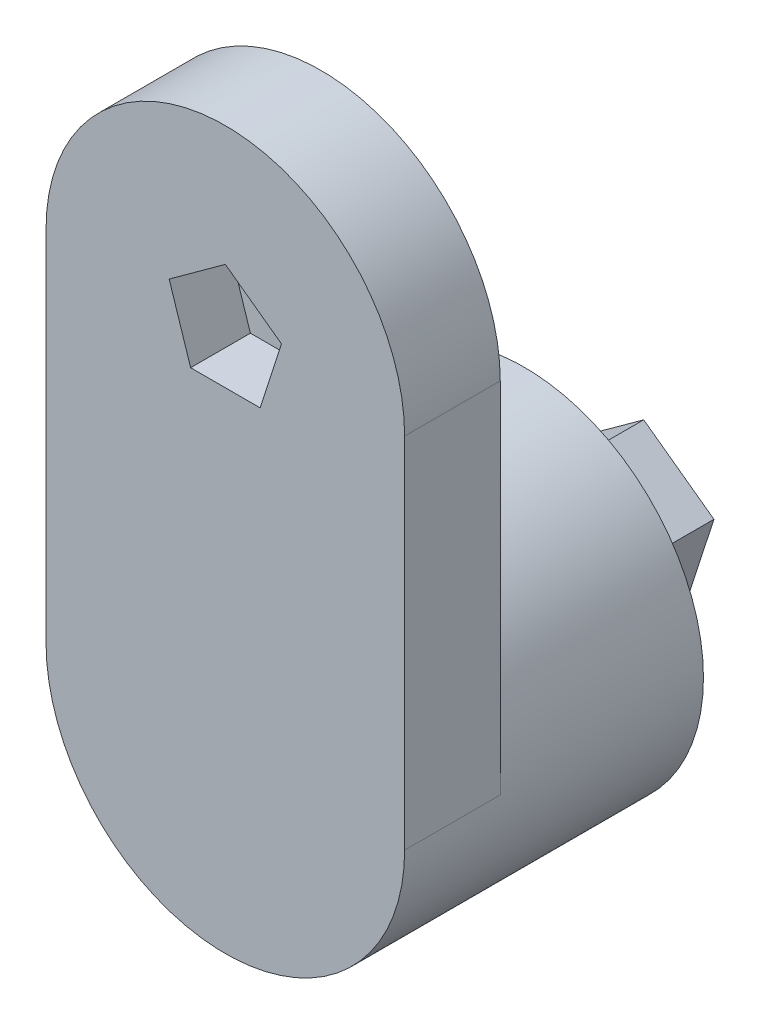
ISO-10303-21;
HEADER;
FILE_DESCRIPTION(('STEP AP214'),'2;1');
FILE_NAME('part.step','',(''),(''),'','','');
FILE_SCHEMA(('AUTOMOTIVE_DESIGN { 1 0 10303 214 1 1 1 1 }'));
ENDSEC;
DATA;
#1=APPLICATION_CONTEXT('core data for automotive mechanical design processes');
#2=APPLICATION_PROTOCOL_DEFINITION('international standard','automotive_design',2000,#1);
#3=PRODUCT_CONTEXT('',#1,'mechanical');
#4=PRODUCT('Part','Part','',(#3));
#5=PRODUCT_RELATED_PRODUCT_CATEGORY('part','',(#4));
#6=PRODUCT_DEFINITION_FORMATION('','',#4);
#7=PRODUCT_DEFINITION_CONTEXT('part definition',#1,'design');
#8=PRODUCT_DEFINITION('design','',#6,#7);
#9=PRODUCT_DEFINITION_SHAPE('','',#8);
#10=(LENGTH_UNIT() NAMED_UNIT(*) SI_UNIT(.MILLI.,.METRE.));
#11=(NAMED_UNIT(*) PLANE_ANGLE_UNIT() SI_UNIT($,.RADIAN.));
#12=(NAMED_UNIT(*) SI_UNIT($,.STERADIAN.) SOLID_ANGLE_UNIT());
#13=UNCERTAINTY_MEASURE_WITH_UNIT(LENGTH_MEASURE(1.E-05),#10,'distance_accuracy_value','');
#14=(GEOMETRIC_REPRESENTATION_CONTEXT(3) GLOBAL_UNCERTAINTY_ASSIGNED_CONTEXT((#13)) GLOBAL_UNIT_ASSIGNED_CONTEXT((#10,
#11,#12)) REPRESENTATION_CONTEXT('',''));
#15=CARTESIAN_POINT('',(0.,0.,0.));
#16=DIRECTION('',(0.,0.,1.));
#17=DIRECTION('',(1.,0.,0.));
#18=AXIS2_PLACEMENT_3D('',#15,#16,#17);
#19=CARTESIAN_POINT('',(0.,15.,0.));
#20=DIRECTION('',(0.,0.,1.));
#21=DIRECTION('',(1.,0.,0.));
#22=AXIS2_PLACEMENT_3D('',#19,#20,#21);
#23=PLANE('',#22);
#24=CARTESIAN_POINT('',(0.,-15.,0.));
#25=DIRECTION('',(0.,0.,-1.));
#26=DIRECTION('',(-1.,0.,0.));
#27=AXIS2_PLACEMENT_3D('',#24,#25,#26);
#28=CIRCLE('',#27,15.);
#29=CARTESIAN_POINT('',(-15.,-15.,0.));
#30=VERTEX_POINT('',#29);
#31=CARTESIAN_POINT('',(15.,-15.,0.));
#32=VERTEX_POINT('',#31);
#33=EDGE_CURVE('E164',#30,#32,#28,.T.);
#34=ORIENTED_EDGE('',*,*,#33,.F.);
#35=DIRECTION('',(0.,-1.,0.));
#36=VECTOR('',#35,1.);
#37=CARTESIAN_POINT('',(-15.,15.,0.));
#38=LINE('',#37,#36);
#39=CARTESIAN_POINT('',(-15.,15.,0.));
#40=VERTEX_POINT('',#39);
#41=EDGE_CURVE('E251',#40,#30,#38,.T.);
#42=ORIENTED_EDGE('',*,*,#41,.F.);
#43=CARTESIAN_POINT('',(0.,15.,0.));
#44=DIRECTION('',(0.,0.,1.));
#45=DIRECTION('',(1.,0.,0.));
#46=AXIS2_PLACEMENT_3D('',#43,#44,#45);
#47=CIRCLE('',#46,15.);
#48=CARTESIAN_POINT('',(15.,15.,0.));
#49=VERTEX_POINT('',#48);
#50=EDGE_CURVE('E220',#49,#40,#47,.T.);
#51=ORIENTED_EDGE('',*,*,#50,.F.);
#52=DIRECTION('',(0.,1.,0.));
#53=VECTOR('',#52,1.);
#54=CARTESIAN_POINT('',(15.,-15.,0.));
#55=LINE('',#54,#53);
#56=EDGE_CURVE('E238',#32,#49,#55,.T.);
#57=ORIENTED_EDGE('',*,*,#56,.F.);
#58=EDGE_LOOP('',(#34,#42,#51,#57));
#59=FACE_BOUND('',#58,.T.);
#60=ADVANCED_FACE('F39',(#59),#23,.F.);
#61=CARTESIAN_POINT('',(0.,15.,8.));
#62=DIRECTION('',(0.,0.,-1.));
#63=DIRECTION('',(-1.,0.,0.));
#64=AXIS2_PLACEMENT_3D('',#61,#62,#63);
#65=CYLINDRICAL_SURFACE('',#64,15.);
#66=ORIENTED_EDGE('',*,*,#50,.T.);
#67=DIRECTION('',(0.,0.,-1.));
#68=VECTOR('',#67,1.);
#69=CARTESIAN_POINT('',(-15.,15.,8.));
#70=LINE('',#69,#68);
#71=CARTESIAN_POINT('',(-15.,15.,8.));
#72=VERTEX_POINT('',#71);
#73=EDGE_CURVE('E11',#72,#40,#70,.T.);
#74=ORIENTED_EDGE('',*,*,#73,.F.);
#75=CARTESIAN_POINT('',(0.,15.,8.));
#76=DIRECTION('',(0.,0.,1.));
#77=DIRECTION('',(1.,0.,0.));
#78=AXIS2_PLACEMENT_3D('',#75,#76,#77);
#79=CIRCLE('',#78,15.);
#80=CARTESIAN_POINT('',(15.,15.,8.));
#81=VERTEX_POINT('',#80);
#82=EDGE_CURVE('E233',#81,#72,#79,.T.);
#83=ORIENTED_EDGE('',*,*,#82,.F.);
#84=DIRECTION('',(0.,0.,-1.));
#85=VECTOR('',#84,1.);
#86=CARTESIAN_POINT('',(15.,15.,8.));
#87=LINE('',#86,#85);
#88=EDGE_CURVE('E247',#81,#49,#87,.T.);
#89=ORIENTED_EDGE('',*,*,#88,.T.);
#90=EDGE_LOOP('',(#66,#74,#83,#89));
#91=FACE_BOUND('',#90,.T.);
#92=ADVANCED_FACE('F41',(#91),#65,.T.);
#93=CARTESIAN_POINT('',(-15.,15.,8.));
#94=DIRECTION('',(1.,0.,0.));
#95=DIRECTION('',(0.,1.,0.));
#96=AXIS2_PLACEMENT_3D('',#93,#94,#95);
#97=PLANE('',#96);
#98=ORIENTED_EDGE('',*,*,#41,.T.);
#99=DIRECTION('',(0.,0.,-1.));
#100=VECTOR('',#99,1.);
#101=CARTESIAN_POINT('',(-15.,-15.,8.));
#102=LINE('',#101,#100);
#103=CARTESIAN_POINT('',(-15.,-15.,8.));
#104=VERTEX_POINT('',#103);
#105=EDGE_CURVE('E48',#104,#30,#102,.T.);
#106=ORIENTED_EDGE('',*,*,#105,.F.);
#107=DIRECTION('',(0.,-1.,0.));
#108=VECTOR('',#107,1.);
#109=CARTESIAN_POINT('',(-15.,15.,8.));
#110=LINE('',#109,#108);
#111=EDGE_CURVE('E237',#72,#104,#110,.T.);
#112=ORIENTED_EDGE('',*,*,#111,.F.);
#113=ORIENTED_EDGE('',*,*,#73,.T.);
#114=EDGE_LOOP('',(#98,#106,#112,#113));
#115=FACE_BOUND('',#114,.T.);
#116=ADVANCED_FACE('F272',(#115),#97,.F.);
#117=CARTESIAN_POINT('',(0.,-15.,8.));
#118=DIRECTION('',(0.,0.,-1.));
#119=DIRECTION('',(-1.,0.,0.));
#120=AXIS2_PLACEMENT_3D('',#117,#118,#119);
#121=CYLINDRICAL_SURFACE('',#120,15.);
#122=ORIENTED_EDGE('',*,*,#105,.T.);
#123=ORIENTED_EDGE('',*,*,#33,.T.);
#124=DIRECTION('',(0.,0.,-1.));
#125=VECTOR('',#124,1.);
#126=CARTESIAN_POINT('',(15.,-15.,8.));
#127=LINE('',#126,#125);
#128=CARTESIAN_POINT('',(15.,-15.,8.));
#129=VERTEX_POINT('',#128);
#130=EDGE_CURVE('E260',#129,#32,#127,.T.);
#131=ORIENTED_EDGE('',*,*,#130,.F.);
#132=CARTESIAN_POINT('',(0.,-15.,8.));
#133=DIRECTION('',(0.,0.,1.));
#134=DIRECTION('',(1.,0.,0.));
#135=AXIS2_PLACEMENT_3D('',#132,#133,#134);
#136=CIRCLE('',#135,15.);
#137=EDGE_CURVE('E241',#104,#129,#136,.T.);
#138=ORIENTED_EDGE('',*,*,#137,.F.);
#139=EDGE_LOOP('',(#122,#123,#131,#138));
#140=FACE_BOUND('',#139,.T.);
#141=CARTESIAN_POINT('',(0.,-15.,-17.));
#142=DIRECTION('',(0.,0.,-1.));
#143=DIRECTION('',(-1.,0.,0.));
#144=AXIS2_PLACEMENT_3D('',#141,#142,#143);
#145=CIRCLE('',#144,15.);
#146=CARTESIAN_POINT('',(-15.,-15.,-17.));
#147=VERTEX_POINT('',#146);
#148=EDGE_CURVE('E168',#147,#147,#145,.T.);
#149=ORIENTED_EDGE('',*,*,#148,.F.);
#150=EDGE_LOOP('',(#149));
#151=FACE_BOUND('',#150,.T.);
#152=ADVANCED_FACE('F268',(#140,#151),#121,.T.);
#153=CARTESIAN_POINT('',(15.,-15.,8.));
#154=DIRECTION('',(-1.,0.,0.));
#155=DIRECTION('',(0.,-1.,0.));
#156=AXIS2_PLACEMENT_3D('',#153,#154,#155);
#157=PLANE('',#156);
#158=ORIENTED_EDGE('',*,*,#56,.T.);
#159=ORIENTED_EDGE('',*,*,#88,.F.);
#160=DIRECTION('',(0.,1.,0.));
#161=VECTOR('',#160,1.);
#162=CARTESIAN_POINT('',(15.,-15.,8.));
#163=LINE('',#162,#161);
#164=EDGE_CURVE('E244',#129,#81,#163,.T.);
#165=ORIENTED_EDGE('',*,*,#164,.F.);
#166=ORIENTED_EDGE('',*,*,#130,.T.);
#167=EDGE_LOOP('',(#158,#159,#165,#166));
#168=FACE_BOUND('',#167,.T.);
#169=ADVANCED_FACE('F279',(#168),#157,.F.);
#170=CARTESIAN_POINT('',(0.,15.,8.));
#171=DIRECTION('',(0.,0.,1.));
#172=DIRECTION('',(1.,0.,0.));
#173=AXIS2_PLACEMENT_3D('',#170,#171,#172);
#174=PLANE('',#173);
#175=DIRECTION('',(-0.809016994374947,0.587785252292473,0.));
#176=VECTOR('',#175,1.);
#177=CARTESIAN_POINT('',(4.70038873731844,16.5272488807061,8.));
#178=LINE('',#177,#176);
#179=CARTESIAN_POINT('',(4.70038873731844,16.5272488807061,8.));
#180=VERTEX_POINT('',#179);
#181=CARTESIAN_POINT('',(0.,19.9422811965253,8.));
#182=VERTEX_POINT('',#181);
#183=EDGE_CURVE('E176',#180,#182,#178,.T.);
#184=ORIENTED_EDGE('',*,*,#183,.F.);
#185=DIRECTION('',(0.309016994374948,0.951056516295154,0.));
#186=VECTOR('',#185,1.);
#187=CARTESIAN_POINT('',(2.905,11.0016105210312,8.));
#188=LINE('',#187,#186);
#189=CARTESIAN_POINT('',(2.905,11.0016105210312,8.));
#190=VERTEX_POINT('',#189);
#191=EDGE_CURVE('E183',#190,#180,#188,.T.);
#192=ORIENTED_EDGE('',*,*,#191,.F.);
#193=DIRECTION('',(1.,0.,0.));
#194=VECTOR('',#193,1.);
#195=CARTESIAN_POINT('',(-2.905,11.0016105210312,8.));
#196=LINE('',#195,#194);
#197=CARTESIAN_POINT('',(-2.905,11.0016105210312,8.));
#198=VERTEX_POINT('',#197);
#199=EDGE_CURVE('E210',#198,#190,#196,.T.);
#200=ORIENTED_EDGE('',*,*,#199,.F.);
#201=DIRECTION('',(0.309016994374947,-0.951056516295154,0.));
#202=VECTOR('',#201,1.);
#203=CARTESIAN_POINT('',(-4.70038873731844,16.5272488807061,8.));
#204=LINE('',#203,#202);
#205=CARTESIAN_POINT('',(-4.70038873731844,16.5272488807061,8.));
#206=VERTEX_POINT('',#205);
#207=EDGE_CURVE('E206',#206,#198,#204,.T.);
#208=ORIENTED_EDGE('',*,*,#207,.F.);
#209=DIRECTION('',(-0.809016994374948,-0.587785252292473,0.));
#210=VECTOR('',#209,1.);
#211=CARTESIAN_POINT('',(0.,19.9422811965253,8.));
#212=LINE('',#211,#210);
#213=EDGE_CURVE('E202',#182,#206,#212,.T.);
#214=ORIENTED_EDGE('',*,*,#213,.F.);
#215=EDGE_LOOP('',(#184,#192,#200,#208,#214));
#216=FACE_BOUND('',#215,.T.);
#217=ORIENTED_EDGE('',*,*,#82,.T.);
#218=ORIENTED_EDGE('',*,*,#111,.T.);
#219=ORIENTED_EDGE('',*,*,#137,.T.);
#220=ORIENTED_EDGE('',*,*,#164,.T.);
#221=EDGE_LOOP('',(#217,#218,#219,#220));
#222=FACE_BOUND('',#221,.T.);
#223=ADVANCED_FACE('F284',(#216,#222),#174,.T.);
#224=CARTESIAN_POINT('',(4.70038873731844,16.5272488807061,3.));
#225=DIRECTION('',(0.587785252292473,0.809016994374947,0.));
#226=DIRECTION('',(-0.809016994374947,0.587785252292473,0.));
#227=AXIS2_PLACEMENT_3D('',#224,#225,#226);
#228=PLANE('',#227);
#229=ORIENTED_EDGE('',*,*,#183,.T.);
#230=DIRECTION('',(0.,0.,1.));
#231=VECTOR('',#230,1.);
#232=CARTESIAN_POINT('',(0.,19.9422811965253,3.));
#233=LINE('',#232,#231);
#234=CARTESIAN_POINT('',(0.,19.9422811965253,3.));
#235=VERTEX_POINT('',#234);
#236=EDGE_CURVE('E199',#235,#182,#233,.T.);
#237=ORIENTED_EDGE('',*,*,#236,.F.);
#238=DIRECTION('',(-0.809016994374947,0.587785252292473,0.));
#239=VECTOR('',#238,1.);
#240=CARTESIAN_POINT('',(4.70038873731844,16.5272488807061,3.));
#241=LINE('',#240,#239);
#242=CARTESIAN_POINT('',(4.70038873731844,16.5272488807061,3.));
#243=VERTEX_POINT('',#242);
#244=EDGE_CURVE('E178',#243,#235,#241,.T.);
#245=ORIENTED_EDGE('',*,*,#244,.F.);
#246=DIRECTION('',(0.,0.,1.));
#247=VECTOR('',#246,1.);
#248=CARTESIAN_POINT('',(4.70038873731844,16.5272488807061,3.));
#249=LINE('',#248,#247);
#250=EDGE_CURVE('E217',#243,#180,#249,.T.);
#251=ORIENTED_EDGE('',*,*,#250,.T.);
#252=EDGE_LOOP('',(#229,#237,#245,#251));
#253=FACE_BOUND('',#252,.T.);
#254=ADVANCED_FACE('F286',(#253),#228,.F.);
#255=CARTESIAN_POINT('',(2.905,11.0016105210312,3.));
#256=DIRECTION('',(0.951056516295154,-0.309016994374948,0.));
#257=DIRECTION('',(0.309016994374948,0.951056516295154,0.));
#258=AXIS2_PLACEMENT_3D('',#255,#256,#257);
#259=PLANE('',#258);
#260=ORIENTED_EDGE('',*,*,#191,.T.);
#261=ORIENTED_EDGE('',*,*,#250,.F.);
#262=DIRECTION('',(0.309016994374948,0.951056516295154,0.));
#263=VECTOR('',#262,1.);
#264=CARTESIAN_POINT('',(2.905,11.0016105210312,3.));
#265=LINE('',#264,#263);
#266=CARTESIAN_POINT('',(2.905,11.0016105210312,3.));
#267=VERTEX_POINT('',#266);
#268=EDGE_CURVE('E195',#267,#243,#265,.T.);
#269=ORIENTED_EDGE('',*,*,#268,.F.);
#270=DIRECTION('',(0.,0.,1.));
#271=VECTOR('',#270,1.);
#272=CARTESIAN_POINT('',(2.905,11.0016105210312,3.));
#273=LINE('',#272,#271);
#274=EDGE_CURVE('E221',#267,#190,#273,.T.);
#275=ORIENTED_EDGE('',*,*,#274,.T.);
#276=EDGE_LOOP('',(#260,#261,#269,#275));
#277=FACE_BOUND('',#276,.T.);
#278=ADVANCED_FACE('F293',(#277),#259,.F.);
#279=CARTESIAN_POINT('',(-2.905,11.0016105210312,3.));
#280=DIRECTION('',(0.,-1.,0.));
#281=DIRECTION('',(1.,0.,0.));
#282=AXIS2_PLACEMENT_3D('',#279,#280,#281);
#283=PLANE('',#282);
#284=ORIENTED_EDGE('',*,*,#199,.T.);
#285=ORIENTED_EDGE('',*,*,#274,.F.);
#286=DIRECTION('',(1.,0.,0.));
#287=VECTOR('',#286,1.);
#288=CARTESIAN_POINT('',(-2.905,11.0016105210312,3.));
#289=LINE('',#288,#287);
#290=CARTESIAN_POINT('',(-2.905,11.0016105210312,3.));
#291=VERTEX_POINT('',#290);
#292=EDGE_CURVE('E191',#291,#267,#289,.T.);
#293=ORIENTED_EDGE('',*,*,#292,.F.);
#294=DIRECTION('',(0.,0.,1.));
#295=VECTOR('',#294,1.);
#296=CARTESIAN_POINT('',(-2.905,11.0016105210312,3.));
#297=LINE('',#296,#295);
#298=EDGE_CURVE('E224',#291,#198,#297,.T.);
#299=ORIENTED_EDGE('',*,*,#298,.T.);
#300=EDGE_LOOP('',(#284,#285,#293,#299));
#301=FACE_BOUND('',#300,.T.);
#302=ADVANCED_FACE('F395',(#301),#283,.F.);
#303=CARTESIAN_POINT('',(-4.70038873731844,16.5272488807061,3.));
#304=DIRECTION('',(-0.951056516295154,-0.309016994374947,0.));
#305=DIRECTION('',(0.309016994374947,-0.951056516295154,0.));
#306=AXIS2_PLACEMENT_3D('',#303,#304,#305);
#307=PLANE('',#306);
#308=ORIENTED_EDGE('',*,*,#207,.T.);
#309=ORIENTED_EDGE('',*,*,#298,.F.);
#310=DIRECTION('',(0.309016994374947,-0.951056516295154,0.));
#311=VECTOR('',#310,1.);
#312=CARTESIAN_POINT('',(-4.70038873731844,16.5272488807061,3.));
#313=LINE('',#312,#311);
#314=CARTESIAN_POINT('',(-4.70038873731844,16.5272488807061,3.));
#315=VERTEX_POINT('',#314);
#316=EDGE_CURVE('E187',#315,#291,#313,.T.);
#317=ORIENTED_EDGE('',*,*,#316,.F.);
#318=DIRECTION('',(0.,0.,1.));
#319=VECTOR('',#318,1.);
#320=CARTESIAN_POINT('',(-4.70038873731844,16.5272488807061,3.));
#321=LINE('',#320,#319);
#322=EDGE_CURVE('E227',#315,#206,#321,.T.);
#323=ORIENTED_EDGE('',*,*,#322,.T.);
#324=EDGE_LOOP('',(#308,#309,#317,#323));
#325=FACE_BOUND('',#324,.T.);
#326=ADVANCED_FACE('F399',(#325),#307,.F.);
#327=CARTESIAN_POINT('',(0.,19.9422811965253,3.));
#328=DIRECTION('',(-0.587785252292473,0.809016994374948,0.));
#329=DIRECTION('',(-0.809016994374948,-0.587785252292473,0.));
#330=AXIS2_PLACEMENT_3D('',#327,#328,#329);
#331=PLANE('',#330);
#332=ORIENTED_EDGE('',*,*,#213,.T.);
#333=ORIENTED_EDGE('',*,*,#322,.F.);
#334=DIRECTION('',(-0.809016994374948,-0.587785252292473,0.));
#335=VECTOR('',#334,1.);
#336=CARTESIAN_POINT('',(0.,19.9422811965253,3.));
#337=LINE('',#336,#335);
#338=EDGE_CURVE('E182',#235,#315,#337,.T.);
#339=ORIENTED_EDGE('',*,*,#338,.F.);
#340=ORIENTED_EDGE('',*,*,#236,.T.);
#341=EDGE_LOOP('',(#332,#333,#339,#340));
#342=FACE_BOUND('',#341,.T.);
#343=ADVANCED_FACE('F391',(#342),#331,.F.);
#344=CARTESIAN_POINT('',(0.,0.,3.));
#345=DIRECTION('',(0.,0.,1.));
#346=DIRECTION('',(1.,0.,0.));
#347=AXIS2_PLACEMENT_3D('',#344,#345,#346);
#348=PLANE('',#347);
#349=ORIENTED_EDGE('',*,*,#244,.T.);
#350=ORIENTED_EDGE('',*,*,#338,.T.);
#351=ORIENTED_EDGE('',*,*,#316,.T.);
#352=ORIENTED_EDGE('',*,*,#292,.T.);
#353=ORIENTED_EDGE('',*,*,#268,.T.);
#354=EDGE_LOOP('',(#349,#350,#351,#352,#353));
#355=FACE_BOUND('',#354,.T.);
#356=ADVANCED_FACE('F330',(#355),#348,.T.);
#357=CARTESIAN_POINT('',(0.,-15.,-17.));
#358=DIRECTION('',(0.,0.,-1.));
#359=DIRECTION('',(-1.,0.,0.));
#360=AXIS2_PLACEMENT_3D('',#357,#358,#359);
#361=PLANE('',#360);
#362=DIRECTION('',(0.809016994374948,0.587785252292472,0.));
#363=VECTOR('',#362,1.);
#364=CARTESIAN_POINT('',(-5.87785252292473,-13.0901699437495,-17.));
#365=LINE('',#364,#363);
#366=CARTESIAN_POINT('',(-5.87785252292473,-13.0901699437495,-17.));
#367=VERTEX_POINT('',#366);
#368=CARTESIAN_POINT('',(0.,-8.81966011250105,-17.));
#369=VERTEX_POINT('',#368);
#370=EDGE_CURVE('E55',#367,#369,#365,.T.);
#371=ORIENTED_EDGE('',*,*,#370,.F.);
#372=DIRECTION('',(-0.309016994374946,0.951056516295154,0.));
#373=VECTOR('',#372,1.);
#374=CARTESIAN_POINT('',(-3.63271264002682,-20.,-17.));
#375=LINE('',#374,#373);
#376=CARTESIAN_POINT('',(-3.63271264002682,-20.,-17.));
#377=VERTEX_POINT('',#376);
#378=EDGE_CURVE('E59',#377,#367,#375,.T.);
#379=ORIENTED_EDGE('',*,*,#378,.F.);
#380=DIRECTION('',(-1.,0.,0.));
#381=VECTOR('',#380,1.);
#382=CARTESIAN_POINT('',(3.6327126400268,-20.,-17.));
#383=LINE('',#382,#381);
#384=CARTESIAN_POINT('',(3.6327126400268,-20.,-17.));
#385=VERTEX_POINT('',#384);
#386=EDGE_CURVE('E473',#385,#377,#383,.T.);
#387=ORIENTED_EDGE('',*,*,#386,.F.);
#388=DIRECTION('',(-0.309016994374948,-0.951056516295153,0.));
#389=VECTOR('',#388,1.);
#390=CARTESIAN_POINT('',(5.87785252292473,-13.0901699437495,-17.));
#391=LINE('',#390,#389);
#392=CARTESIAN_POINT('',(5.87785252292473,-13.0901699437495,-17.));
#393=VERTEX_POINT('',#392);
#394=EDGE_CURVE('E488',#393,#385,#391,.T.);
#395=ORIENTED_EDGE('',*,*,#394,.F.);
#396=DIRECTION('',(0.809016994374947,-0.587785252292474,0.));
#397=VECTOR('',#396,1.);
#398=CARTESIAN_POINT('',(0.,-8.81966011250105,-17.));
#399=LINE('',#398,#397);
#400=EDGE_CURVE('E490',#369,#393,#399,.T.);
#401=ORIENTED_EDGE('',*,*,#400,.F.);
#402=EDGE_LOOP('',(#371,#379,#387,#395,#401));
#403=FACE_BOUND('',#402,.T.);
#404=ORIENTED_EDGE('',*,*,#148,.T.);
#405=EDGE_LOOP('',(#404));
#406=FACE_BOUND('',#405,.T.);
#407=ADVANCED_FACE('F325',(#403,#406),#361,.T.);
#408=CARTESIAN_POINT('',(-5.87785252292473,-13.0901699437495,-27.));
#409=DIRECTION('',(0.587785252292472,-0.809016994374948,0.));
#410=DIRECTION('',(0.809016994374948,0.587785252292472,0.));
#411=AXIS2_PLACEMENT_3D('',#408,#409,#410);
#412=PLANE('',#411);
#413=ORIENTED_EDGE('',*,*,#370,.T.);
#414=DIRECTION('',(0.,0.,1.));
#415=VECTOR('',#414,1.);
#416=CARTESIAN_POINT('',(0.,-8.81966011250105,-27.));
#417=LINE('',#416,#415);
#418=CARTESIAN_POINT('',(0.,-8.81966011250105,-27.));
#419=VERTEX_POINT('',#418);
#420=EDGE_CURVE('E144',#419,#369,#417,.T.);
#421=ORIENTED_EDGE('',*,*,#420,.F.);
#422=DIRECTION('',(0.809016994374948,0.587785252292472,0.));
#423=VECTOR('',#422,1.);
#424=CARTESIAN_POINT('',(-5.87785252292473,-13.0901699437495,-27.));
#425=LINE('',#424,#423);
#426=CARTESIAN_POINT('',(-5.87785252292473,-13.0901699437495,-27.));
#427=VERTEX_POINT('',#426);
#428=EDGE_CURVE('E151',#427,#419,#425,.T.);
#429=ORIENTED_EDGE('',*,*,#428,.F.);
#430=DIRECTION('',(0.,0.,1.));
#431=VECTOR('',#430,1.);
#432=CARTESIAN_POINT('',(-5.87785252292473,-13.0901699437495,-27.));
#433=LINE('',#432,#431);
#434=EDGE_CURVE('E469',#427,#367,#433,.T.);
#435=ORIENTED_EDGE('',*,*,#434,.T.);
#436=EDGE_LOOP('',(#413,#421,#429,#435));
#437=FACE_BOUND('',#436,.T.);
#438=ADVANCED_FACE('F162',(#437),#412,.F.);
#439=CARTESIAN_POINT('',(0.,-8.81966011250105,-27.));
#440=DIRECTION('',(-0.587785252292474,-0.809016994374947,0.));
#441=DIRECTION('',(0.809016994374947,-0.587785252292474,0.));
#442=AXIS2_PLACEMENT_3D('',#439,#440,#441);
#443=PLANE('',#442);
#444=ORIENTED_EDGE('',*,*,#400,.T.);
#445=DIRECTION('',(0.,0.,1.));
#446=VECTOR('',#445,1.);
#447=CARTESIAN_POINT('',(5.87785252292473,-13.0901699437495,-27.));
#448=LINE('',#447,#446);
#449=CARTESIAN_POINT('',(5.87785252292473,-13.0901699437495,-27.));
#450=VERTEX_POINT('',#449);
#451=EDGE_CURVE('E146',#450,#393,#448,.T.);
#452=ORIENTED_EDGE('',*,*,#451,.F.);
#453=DIRECTION('',(0.809016994374947,-0.587785252292474,0.));
#454=VECTOR('',#453,1.);
#455=CARTESIAN_POINT('',(0.,-8.81966011250105,-27.));
#456=LINE('',#455,#454);
#457=EDGE_CURVE('E139',#419,#450,#456,.T.);
#458=ORIENTED_EDGE('',*,*,#457,.F.);
#459=ORIENTED_EDGE('',*,*,#420,.T.);
#460=EDGE_LOOP('',(#444,#452,#458,#459));
#461=FACE_BOUND('',#460,.T.);
#462=ADVANCED_FACE('F142',(#461),#443,.F.);
#463=CARTESIAN_POINT('',(5.87785252292473,-13.0901699437495,-27.));
#464=DIRECTION('',(-0.951056516295153,0.309016994374948,0.));
#465=DIRECTION('',(-0.309016994374948,-0.951056516295153,0.));
#466=AXIS2_PLACEMENT_3D('',#463,#464,#465);
#467=PLANE('',#466);
#468=ORIENTED_EDGE('',*,*,#394,.T.);
#469=DIRECTION('',(0.,0.,1.));
#470=VECTOR('',#469,1.);
#471=CARTESIAN_POINT('',(3.6327126400268,-20.,-27.));
#472=LINE('',#471,#470);
#473=CARTESIAN_POINT('',(3.6327126400268,-20.,-27.));
#474=VERTEX_POINT('',#473);
#475=EDGE_CURVE('E170',#474,#385,#472,.T.);
#476=ORIENTED_EDGE('',*,*,#475,.F.);
#477=DIRECTION('',(-0.309016994374948,-0.951056516295153,0.));
#478=VECTOR('',#477,1.);
#479=CARTESIAN_POINT('',(5.87785252292473,-13.0901699437495,-27.));
#480=LINE('',#479,#478);
#481=EDGE_CURVE('E150',#450,#474,#480,.T.);
#482=ORIENTED_EDGE('',*,*,#481,.F.);
#483=ORIENTED_EDGE('',*,*,#451,.T.);
#484=EDGE_LOOP('',(#468,#476,#482,#483));
#485=FACE_BOUND('',#484,.T.);
#486=ADVANCED_FACE('F348',(#485),#467,.F.);
#487=CARTESIAN_POINT('',(3.6327126400268,-20.,-27.));
#488=DIRECTION('',(0.,1.,0.));
#489=DIRECTION('',(-1.,0.,0.));
#490=AXIS2_PLACEMENT_3D('',#487,#488,#489);
#491=PLANE('',#490);
#492=ORIENTED_EDGE('',*,*,#386,.T.);
#493=DIRECTION('',(0.,0.,1.));
#494=VECTOR('',#493,1.);
#495=CARTESIAN_POINT('',(-3.63271264002682,-20.,-27.));
#496=LINE('',#495,#494);
#497=CARTESIAN_POINT('',(-3.63271264002682,-20.,-27.));
#498=VERTEX_POINT('',#497);
#499=EDGE_CURVE('E471',#498,#377,#496,.T.);
#500=ORIENTED_EDGE('',*,*,#499,.F.);
#501=DIRECTION('',(-1.,0.,0.));
#502=VECTOR('',#501,1.);
#503=CARTESIAN_POINT('',(3.6327126400268,-20.,-27.));
#504=LINE('',#503,#502);
#505=EDGE_CURVE('E480',#474,#498,#504,.T.);
#506=ORIENTED_EDGE('',*,*,#505,.F.);
#507=ORIENTED_EDGE('',*,*,#475,.T.);
#508=EDGE_LOOP('',(#492,#500,#506,#507));
#509=FACE_BOUND('',#508,.T.);
#510=ADVANCED_FACE('F357',(#509),#491,.F.);
#511=CARTESIAN_POINT('',(-3.63271264002682,-20.,-27.));
#512=DIRECTION('',(0.951056516295154,0.309016994374946,0.));
#513=DIRECTION('',(-0.309016994374946,0.951056516295154,0.));
#514=AXIS2_PLACEMENT_3D('',#511,#512,#513);
#515=PLANE('',#514);
#516=ORIENTED_EDGE('',*,*,#378,.T.);
#517=ORIENTED_EDGE('',*,*,#434,.F.);
#518=DIRECTION('',(-0.309016994374946,0.951056516295154,0.));
#519=VECTOR('',#518,1.);
#520=CARTESIAN_POINT('',(-3.63271264002682,-20.,-27.));
#521=LINE('',#520,#519);
#522=EDGE_CURVE('E156',#498,#427,#521,.T.);
#523=ORIENTED_EDGE('',*,*,#522,.F.);
#524=ORIENTED_EDGE('',*,*,#499,.T.);
#525=EDGE_LOOP('',(#516,#517,#523,#524));
#526=FACE_BOUND('',#525,.T.);
#527=ADVANCED_FACE('F367',(#526),#515,.F.);
#528=CARTESIAN_POINT('',(0.,0.,-27.));
#529=DIRECTION('',(0.,0.,-1.));
#530=DIRECTION('',(-1.,0.,0.));
#531=AXIS2_PLACEMENT_3D('',#528,#529,#530);
#532=PLANE('',#531);
#533=ORIENTED_EDGE('',*,*,#428,.T.);
#534=ORIENTED_EDGE('',*,*,#457,.T.);
#535=ORIENTED_EDGE('',*,*,#481,.T.);
#536=ORIENTED_EDGE('',*,*,#505,.T.);
#537=ORIENTED_EDGE('',*,*,#522,.T.);
#538=EDGE_LOOP('',(#533,#534,#535,#536,#537));
#539=FACE_BOUND('',#538,.T.);
#540=ADVANCED_FACE('F154',(#539),#532,.T.);
#541=CLOSED_SHELL('',(#60,#92,#116,#152,#169,#223,#254,#278,#302,#326,#343,#356,#407,#438,#462,
#486,#510,#527,#540));
#542=MANIFOLD_SOLID_BREP('B2',#541);
#543=ADVANCED_BREP_SHAPE_REPRESENTATION('',(#18,#542),#14);
#544=SHAPE_DEFINITION_REPRESENTATION(#9,#543);
ENDSEC;
END-ISO-10303-21;
